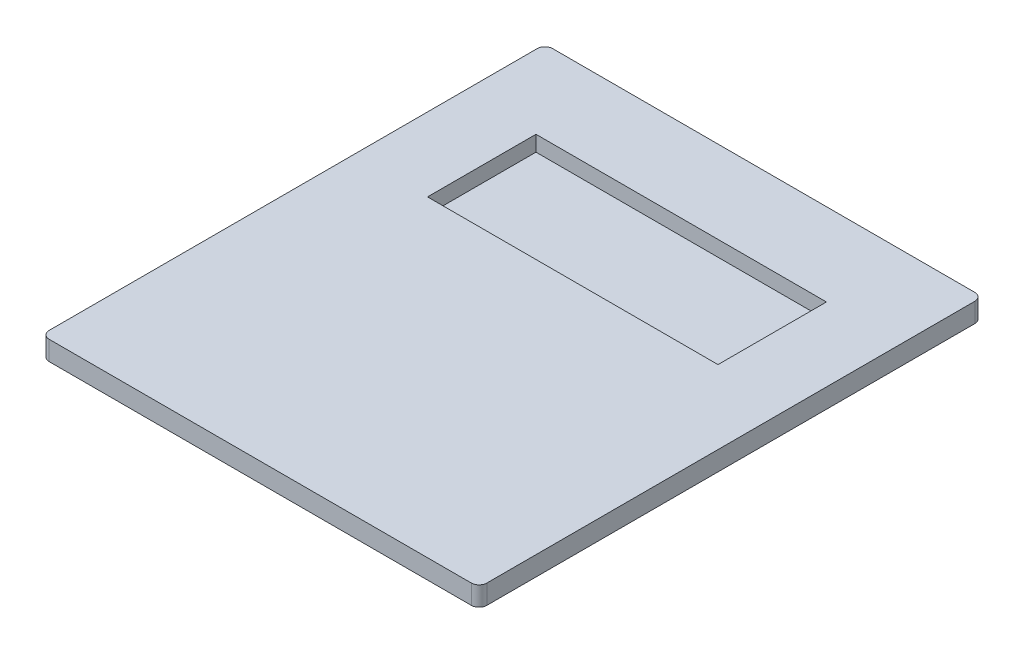
ISO-10303-21;
HEADER;
FILE_DESCRIPTION(('STEP AP214'),'2;1');
FILE_NAME('part.step','',(''),(''),'','','');
FILE_SCHEMA(('AUTOMOTIVE_DESIGN { 1 0 10303 214 1 1 1 1 }'));
ENDSEC;
DATA;
#1=APPLICATION_CONTEXT('core data for automotive mechanical design processes');
#2=APPLICATION_PROTOCOL_DEFINITION('international standard','automotive_design',2000,#1);
#3=PRODUCT_CONTEXT('',#1,'mechanical');
#4=PRODUCT('Part','Part','',(#3));
#5=PRODUCT_RELATED_PRODUCT_CATEGORY('part','',(#4));
#6=PRODUCT_DEFINITION_FORMATION('','',#4);
#7=PRODUCT_DEFINITION_CONTEXT('part definition',#1,'design');
#8=PRODUCT_DEFINITION('design','',#6,#7);
#9=PRODUCT_DEFINITION_SHAPE('','',#8);
#10=(LENGTH_UNIT() NAMED_UNIT(*) SI_UNIT(.MILLI.,.METRE.));
#11=(NAMED_UNIT(*) PLANE_ANGLE_UNIT() SI_UNIT($,.RADIAN.));
#12=(NAMED_UNIT(*) SI_UNIT($,.STERADIAN.) SOLID_ANGLE_UNIT());
#13=UNCERTAINTY_MEASURE_WITH_UNIT(LENGTH_MEASURE(1.E-05),#10,'distance_accuracy_value','');
#14=(GEOMETRIC_REPRESENTATION_CONTEXT(3) GLOBAL_UNCERTAINTY_ASSIGNED_CONTEXT((#13)) GLOBAL_UNIT_ASSIGNED_CONTEXT((#10,
#11,#12)) REPRESENTATION_CONTEXT('',''));
#15=CARTESIAN_POINT('',(0.,0.,0.));
#16=DIRECTION('',(0.,0.,1.));
#17=DIRECTION('',(1.,0.,0.));
#18=AXIS2_PLACEMENT_3D('',#15,#16,#17);
#19=CARTESIAN_POINT('',(56.5,5.,65.));
#20=DIRECTION('',(-1.,0.,0.));
#21=DIRECTION('',(0.,0.,1.));
#22=AXIS2_PLACEMENT_3D('',#19,#20,#21);
#23=PLANE('',#22);
#24=DIRECTION('',(0.,0.,-1.));
#25=VECTOR('',#24,1.);
#26=CARTESIAN_POINT('',(56.5,0.,65.));
#27=LINE('',#26,#25);
#28=CARTESIAN_POINT('',(56.5,0.,63.));
#29=VERTEX_POINT('',#28);
#30=CARTESIAN_POINT('',(56.5,0.,-63.));
#31=VERTEX_POINT('',#30);
#32=EDGE_CURVE('E158',#29,#31,#27,.T.);
#33=ORIENTED_EDGE('',*,*,#32,.T.);
#34=DIRECTION('',(0.,-1.,0.));
#35=VECTOR('',#34,1.);
#36=CARTESIAN_POINT('',(56.5,5.,-63.));
#37=LINE('',#36,#35);
#38=CARTESIAN_POINT('',(56.5,5.,-63.));
#39=VERTEX_POINT('',#38);
#40=EDGE_CURVE('E11',#31,#39,#37,.F.);
#41=ORIENTED_EDGE('',*,*,#40,.T.);
#42=DIRECTION('',(0.,0.,-1.));
#43=VECTOR('',#42,1.);
#44=CARTESIAN_POINT('',(56.5,5.,65.));
#45=LINE('',#44,#43);
#46=CARTESIAN_POINT('',(56.5,5.,63.));
#47=VERTEX_POINT('',#46);
#48=EDGE_CURVE('E162',#47,#39,#45,.T.);
#49=ORIENTED_EDGE('',*,*,#48,.F.);
#50=DIRECTION('',(0.,-1.,0.));
#51=VECTOR('',#50,1.);
#52=CARTESIAN_POINT('',(56.5,0.,63.));
#53=LINE('',#52,#51);
#54=EDGE_CURVE('E42',#47,#29,#53,.T.);
#55=ORIENTED_EDGE('',*,*,#54,.T.);
#56=EDGE_LOOP('',(#33,#41,#49,#55));
#57=FACE_BOUND('',#56,.T.);
#58=ADVANCED_FACE('F34',(#57),#23,.F.);
#59=CARTESIAN_POINT('',(56.5,5.,-65.));
#60=DIRECTION('',(0.,0.,1.));
#61=DIRECTION('',(1.,0.,0.));
#62=AXIS2_PLACEMENT_3D('',#59,#60,#61);
#63=PLANE('',#62);
#64=DIRECTION('',(-1.,0.,0.));
#65=VECTOR('',#64,1.);
#66=CARTESIAN_POINT('',(56.5,0.,-65.));
#67=LINE('',#66,#65);
#68=CARTESIAN_POINT('',(54.5,0.,-65.));
#69=VERTEX_POINT('',#68);
#70=CARTESIAN_POINT('',(-54.5,0.,-65.));
#71=VERTEX_POINT('',#70);
#72=EDGE_CURVE('E177',#69,#71,#67,.T.);
#73=ORIENTED_EDGE('',*,*,#72,.T.);
#74=DIRECTION('',(0.,-1.,0.));
#75=VECTOR('',#74,1.);
#76=CARTESIAN_POINT('',(-54.5,5.,-65.));
#77=LINE('',#76,#75);
#78=CARTESIAN_POINT('',(-54.5,5.,-65.));
#79=VERTEX_POINT('',#78);
#80=EDGE_CURVE('E200',#71,#79,#77,.F.);
#81=ORIENTED_EDGE('',*,*,#80,.T.);
#82=DIRECTION('',(-1.,0.,0.));
#83=VECTOR('',#82,1.);
#84=CARTESIAN_POINT('',(56.5,5.,-65.));
#85=LINE('',#84,#83);
#86=CARTESIAN_POINT('',(54.5,5.,-65.));
#87=VERTEX_POINT('',#86);
#88=EDGE_CURVE('E165',#87,#79,#85,.T.);
#89=ORIENTED_EDGE('',*,*,#88,.F.);
#90=DIRECTION('',(0.,-1.,0.));
#91=VECTOR('',#90,1.);
#92=CARTESIAN_POINT('',(54.5,5.,-65.));
#93=LINE('',#92,#91);
#94=EDGE_CURVE('E197',#87,#69,#93,.T.);
#95=ORIENTED_EDGE('',*,*,#94,.T.);
#96=EDGE_LOOP('',(#73,#81,#89,#95));
#97=FACE_BOUND('',#96,.T.);
#98=ADVANCED_FACE('F231',(#97),#63,.F.);
#99=CARTESIAN_POINT('',(-56.5,5.,65.));
#100=DIRECTION('',(-1.,0.,0.));
#101=DIRECTION('',(0.,0.,1.));
#102=AXIS2_PLACEMENT_3D('',#99,#100,#101);
#103=PLANE('',#102);
#104=DIRECTION('',(0.,0.,-1.));
#105=VECTOR('',#104,1.);
#106=CARTESIAN_POINT('',(-56.5,5.,65.));
#107=LINE('',#106,#105);
#108=CARTESIAN_POINT('',(-56.5,5.,63.));
#109=VERTEX_POINT('',#108);
#110=CARTESIAN_POINT('',(-56.5,5.,-63.));
#111=VERTEX_POINT('',#110);
#112=EDGE_CURVE('E169',#109,#111,#107,.T.);
#113=ORIENTED_EDGE('',*,*,#112,.T.);
#114=DIRECTION('',(0.,-1.,0.));
#115=VECTOR('',#114,1.);
#116=CARTESIAN_POINT('',(-56.5,0.,-63.));
#117=LINE('',#116,#115);
#118=CARTESIAN_POINT('',(-56.5,0.,-63.));
#119=VERTEX_POINT('',#118);
#120=EDGE_CURVE('E186',#111,#119,#117,.T.);
#121=ORIENTED_EDGE('',*,*,#120,.T.);
#122=DIRECTION('',(0.,0.,-1.));
#123=VECTOR('',#122,1.);
#124=CARTESIAN_POINT('',(-56.5,0.,65.));
#125=LINE('',#124,#123);
#126=CARTESIAN_POINT('',(-56.5,0.,63.));
#127=VERTEX_POINT('',#126);
#128=EDGE_CURVE('E180',#127,#119,#125,.T.);
#129=ORIENTED_EDGE('',*,*,#128,.F.);
#130=DIRECTION('',(0.,-1.,0.));
#131=VECTOR('',#130,1.);
#132=CARTESIAN_POINT('',(-56.5,5.,63.));
#133=LINE('',#132,#131);
#134=EDGE_CURVE('E174',#127,#109,#133,.F.);
#135=ORIENTED_EDGE('',*,*,#134,.T.);
#136=EDGE_LOOP('',(#113,#121,#129,#135));
#137=FACE_BOUND('',#136,.T.);
#138=ADVANCED_FACE('F240',(#137),#103,.T.);
#139=CARTESIAN_POINT('',(56.5,5.,65.));
#140=DIRECTION('',(0.,0.,1.));
#141=DIRECTION('',(1.,0.,0.));
#142=AXIS2_PLACEMENT_3D('',#139,#140,#141);
#143=PLANE('',#142);
#144=DIRECTION('',(-1.,0.,0.));
#145=VECTOR('',#144,1.);
#146=CARTESIAN_POINT('',(56.5,5.,65.));
#147=LINE('',#146,#145);
#148=CARTESIAN_POINT('',(54.5,5.,65.));
#149=VERTEX_POINT('',#148);
#150=CARTESIAN_POINT('',(-54.5,5.,65.));
#151=VERTEX_POINT('',#150);
#152=EDGE_CURVE('E172',#149,#151,#147,.T.);
#153=ORIENTED_EDGE('',*,*,#152,.T.);
#154=DIRECTION('',(0.,-1.,0.));
#155=VECTOR('',#154,1.);
#156=CARTESIAN_POINT('',(-54.5,5.,65.));
#157=LINE('',#156,#155);
#158=CARTESIAN_POINT('',(-54.5,0.,65.));
#159=VERTEX_POINT('',#158);
#160=EDGE_CURVE('E211',#151,#159,#157,.T.);
#161=ORIENTED_EDGE('',*,*,#160,.T.);
#162=DIRECTION('',(-1.,0.,0.));
#163=VECTOR('',#162,1.);
#164=CARTESIAN_POINT('',(56.5,0.,65.));
#165=LINE('',#164,#163);
#166=CARTESIAN_POINT('',(54.5,0.,65.));
#167=VERTEX_POINT('',#166);
#168=EDGE_CURVE('E166',#167,#159,#165,.T.);
#169=ORIENTED_EDGE('',*,*,#168,.F.);
#170=DIRECTION('',(0.,-1.,0.));
#171=VECTOR('',#170,1.);
#172=CARTESIAN_POINT('',(54.5,5.,65.));
#173=LINE('',#172,#171);
#174=EDGE_CURVE('E209',#167,#149,#173,.F.);
#175=ORIENTED_EDGE('',*,*,#174,.T.);
#176=EDGE_LOOP('',(#153,#161,#169,#175));
#177=FACE_BOUND('',#176,.T.);
#178=ADVANCED_FACE('F246',(#177),#143,.T.);
#179=CARTESIAN_POINT('',(0.,5.,0.));
#180=DIRECTION('',(0.,1.,0.));
#181=DIRECTION('',(0.,0.,1.));
#182=AXIS2_PLACEMENT_3D('',#179,#180,#181);
#183=PLANE('',#182);
#184=DIRECTION('',(0.,0.,1.));
#185=VECTOR('',#184,1.);
#186=CARTESIAN_POINT('',(-37.5,5.,-43.6893203883494));
#187=LINE('',#186,#185);
#188=CARTESIAN_POINT('',(-37.5,5.,-43.6893203883494));
#189=VERTEX_POINT('',#188);
#190=CARTESIAN_POINT('',(-37.5,5.,-15.6893203883494));
#191=VERTEX_POINT('',#190);
#192=EDGE_CURVE('E49',#189,#191,#187,.T.);
#193=ORIENTED_EDGE('',*,*,#192,.F.);
#194=DIRECTION('',(1.,0.,0.));
#195=VECTOR('',#194,1.);
#196=CARTESIAN_POINT('',(-37.5,5.,-43.6893203883494));
#197=LINE('',#196,#195);
#198=CARTESIAN_POINT('',(37.5,5.,-43.6893203883494));
#199=VERTEX_POINT('',#198);
#200=EDGE_CURVE('E143',#189,#199,#197,.T.);
#201=ORIENTED_EDGE('',*,*,#200,.T.);
#202=DIRECTION('',(0.,0.,1.));
#203=VECTOR('',#202,1.);
#204=CARTESIAN_POINT('',(37.5,5.,-43.6893203883494));
#205=LINE('',#204,#203);
#206=CARTESIAN_POINT('',(37.5,5.,-15.6893203883494));
#207=VERTEX_POINT('',#206);
#208=EDGE_CURVE('E146',#199,#207,#205,.T.);
#209=ORIENTED_EDGE('',*,*,#208,.T.);
#210=DIRECTION('',(1.,0.,0.));
#211=VECTOR('',#210,1.);
#212=CARTESIAN_POINT('',(-37.5,5.,-15.6893203883494));
#213=LINE('',#212,#211);
#214=EDGE_CURVE('E152',#191,#207,#213,.T.);
#215=ORIENTED_EDGE('',*,*,#214,.F.);
#216=EDGE_LOOP('',(#193,#201,#209,#215));
#217=FACE_BOUND('',#216,.T.);
#218=ORIENTED_EDGE('',*,*,#88,.T.);
#219=CARTESIAN_POINT('',(-54.5,5.,-63.));
#220=DIRECTION('',(0.,1.,0.));
#221=DIRECTION('',(0.,0.,1.));
#222=AXIS2_PLACEMENT_3D('',#219,#220,#221);
#223=CIRCLE('',#222,2.);
#224=EDGE_CURVE('E207',#79,#111,#223,.T.);
#225=ORIENTED_EDGE('',*,*,#224,.T.);
#226=ORIENTED_EDGE('',*,*,#112,.F.);
#227=CARTESIAN_POINT('',(-54.5,5.,63.));
#228=DIRECTION('',(0.,1.,0.));
#229=DIRECTION('',(0.,0.,1.));
#230=AXIS2_PLACEMENT_3D('',#227,#228,#229);
#231=CIRCLE('',#230,2.);
#232=EDGE_CURVE('E57',#109,#151,#231,.T.);
#233=ORIENTED_EDGE('',*,*,#232,.T.);
#234=ORIENTED_EDGE('',*,*,#152,.F.);
#235=CARTESIAN_POINT('',(54.5,5.,63.));
#236=DIRECTION('',(0.,1.,0.));
#237=DIRECTION('',(0.,0.,1.));
#238=AXIS2_PLACEMENT_3D('',#235,#236,#237);
#239=CIRCLE('',#238,2.);
#240=EDGE_CURVE('E202',#149,#47,#239,.T.);
#241=ORIENTED_EDGE('',*,*,#240,.T.);
#242=ORIENTED_EDGE('',*,*,#48,.T.);
#243=CARTESIAN_POINT('',(54.5,5.,-63.));
#244=DIRECTION('',(0.,1.,0.));
#245=DIRECTION('',(0.,0.,1.));
#246=AXIS2_PLACEMENT_3D('',#243,#244,#245);
#247=CIRCLE('',#246,2.);
#248=EDGE_CURVE('E204',#39,#87,#247,.T.);
#249=ORIENTED_EDGE('',*,*,#248,.T.);
#250=EDGE_LOOP('',(#218,#225,#226,#233,#234,#241,#242,#249));
#251=FACE_BOUND('',#250,.T.);
#252=ADVANCED_FACE('F234',(#217,#251),#183,.T.);
#253=CARTESIAN_POINT('',(0.,0.,0.));
#254=DIRECTION('',(0.,1.,0.));
#255=DIRECTION('',(0.,0.,1.));
#256=AXIS2_PLACEMENT_3D('',#253,#254,#255);
#257=PLANE('',#256);
#258=ORIENTED_EDGE('',*,*,#128,.T.);
#259=CARTESIAN_POINT('',(-54.5,0.,-63.));
#260=DIRECTION('',(0.,1.,0.));
#261=DIRECTION('',(0.,0.,1.));
#262=AXIS2_PLACEMENT_3D('',#259,#260,#261);
#263=CIRCLE('',#262,2.);
#264=EDGE_CURVE('E195',#119,#71,#263,.F.);
#265=ORIENTED_EDGE('',*,*,#264,.T.);
#266=ORIENTED_EDGE('',*,*,#72,.F.);
#267=CARTESIAN_POINT('',(54.5,0.,-63.));
#268=DIRECTION('',(0.,1.,0.));
#269=DIRECTION('',(0.,0.,1.));
#270=AXIS2_PLACEMENT_3D('',#267,#268,#269);
#271=CIRCLE('',#270,2.);
#272=EDGE_CURVE('E191',#69,#31,#271,.F.);
#273=ORIENTED_EDGE('',*,*,#272,.T.);
#274=ORIENTED_EDGE('',*,*,#32,.F.);
#275=CARTESIAN_POINT('',(54.5,0.,63.));
#276=DIRECTION('',(0.,1.,0.));
#277=DIRECTION('',(0.,0.,1.));
#278=AXIS2_PLACEMENT_3D('',#275,#276,#277);
#279=CIRCLE('',#278,2.);
#280=EDGE_CURVE('E189',#29,#167,#279,.F.);
#281=ORIENTED_EDGE('',*,*,#280,.T.);
#282=ORIENTED_EDGE('',*,*,#168,.T.);
#283=CARTESIAN_POINT('',(-54.5,0.,63.));
#284=DIRECTION('',(0.,1.,0.));
#285=DIRECTION('',(0.,0.,1.));
#286=AXIS2_PLACEMENT_3D('',#283,#284,#285);
#287=CIRCLE('',#286,2.);
#288=EDGE_CURVE('E193',#159,#127,#287,.F.);
#289=ORIENTED_EDGE('',*,*,#288,.T.);
#290=EDGE_LOOP('',(#258,#265,#266,#273,#274,#281,#282,#289));
#291=FACE_BOUND('',#290,.T.);
#292=ADVANCED_FACE('F222',(#291),#257,.F.);
#293=CARTESIAN_POINT('',(-54.5,5.,-63.));
#294=DIRECTION('',(0.,1.,0.));
#295=DIRECTION('',(0.,0.,1.));
#296=AXIS2_PLACEMENT_3D('',#293,#294,#295);
#297=CYLINDRICAL_SURFACE('',#296,2.);
#298=ORIENTED_EDGE('',*,*,#224,.F.);
#299=ORIENTED_EDGE('',*,*,#80,.F.);
#300=ORIENTED_EDGE('',*,*,#264,.F.);
#301=ORIENTED_EDGE('',*,*,#120,.F.);
#302=EDGE_LOOP('',(#298,#299,#300,#301));
#303=FACE_BOUND('',#302,.T.);
#304=ADVANCED_FACE('F237',(#303),#297,.T.);
#305=CARTESIAN_POINT('',(-54.5,5.,63.));
#306=DIRECTION('',(0.,-1.,0.));
#307=DIRECTION('',(0.,0.,-1.));
#308=AXIS2_PLACEMENT_3D('',#305,#306,#307);
#309=CYLINDRICAL_SURFACE('',#308,2.);
#310=ORIENTED_EDGE('',*,*,#232,.F.);
#311=ORIENTED_EDGE('',*,*,#134,.F.);
#312=ORIENTED_EDGE('',*,*,#288,.F.);
#313=ORIENTED_EDGE('',*,*,#160,.F.);
#314=EDGE_LOOP('',(#310,#311,#312,#313));
#315=FACE_BOUND('',#314,.T.);
#316=ADVANCED_FACE('F244',(#315),#309,.T.);
#317=CARTESIAN_POINT('',(54.5,5.,-63.));
#318=DIRECTION('',(0.,-1.,0.));
#319=DIRECTION('',(0.,0.,-1.));
#320=AXIS2_PLACEMENT_3D('',#317,#318,#319);
#321=CYLINDRICAL_SURFACE('',#320,2.);
#322=ORIENTED_EDGE('',*,*,#248,.F.);
#323=ORIENTED_EDGE('',*,*,#40,.F.);
#324=ORIENTED_EDGE('',*,*,#272,.F.);
#325=ORIENTED_EDGE('',*,*,#94,.F.);
#326=EDGE_LOOP('',(#322,#323,#324,#325));
#327=FACE_BOUND('',#326,.T.);
#328=ADVANCED_FACE('F228',(#327),#321,.T.);
#329=CARTESIAN_POINT('',(54.5,5.,63.));
#330=DIRECTION('',(0.,1.,0.));
#331=DIRECTION('',(0.,0.,1.));
#332=AXIS2_PLACEMENT_3D('',#329,#330,#331);
#333=CYLINDRICAL_SURFACE('',#332,2.);
#334=ORIENTED_EDGE('',*,*,#240,.F.);
#335=ORIENTED_EDGE('',*,*,#174,.F.);
#336=ORIENTED_EDGE('',*,*,#280,.F.);
#337=ORIENTED_EDGE('',*,*,#54,.F.);
#338=EDGE_LOOP('',(#334,#335,#336,#337));
#339=FACE_BOUND('',#338,.T.);
#340=ADVANCED_FACE('F36',(#339),#333,.T.);
#341=CARTESIAN_POINT('',(-37.5,1.,-43.6893203883494));
#342=DIRECTION('',(-1.,0.,0.));
#343=DIRECTION('',(0.,0.,1.));
#344=AXIS2_PLACEMENT_3D('',#341,#342,#343);
#345=PLANE('',#344);
#346=ORIENTED_EDGE('',*,*,#192,.T.);
#347=DIRECTION('',(0.,1.,0.));
#348=VECTOR('',#347,1.);
#349=CARTESIAN_POINT('',(-37.5,1.,-15.6893203883494));
#350=LINE('',#349,#348);
#351=CARTESIAN_POINT('',(-37.5,1.,-15.6893203883494));
#352=VERTEX_POINT('',#351);
#353=EDGE_CURVE('E122',#352,#191,#350,.T.);
#354=ORIENTED_EDGE('',*,*,#353,.F.);
#355=DIRECTION('',(0.,0.,1.));
#356=VECTOR('',#355,1.);
#357=CARTESIAN_POINT('',(-37.5,1.,-43.6893203883494));
#358=LINE('',#357,#356);
#359=CARTESIAN_POINT('',(-37.5,1.,-43.6893203883494));
#360=VERTEX_POINT('',#359);
#361=EDGE_CURVE('E126',#360,#352,#358,.T.);
#362=ORIENTED_EDGE('',*,*,#361,.F.);
#363=DIRECTION('',(0.,1.,0.));
#364=VECTOR('',#363,1.);
#365=CARTESIAN_POINT('',(-37.5,1.,-43.6893203883494));
#366=LINE('',#365,#364);
#367=EDGE_CURVE('E156',#360,#189,#366,.T.);
#368=ORIENTED_EDGE('',*,*,#367,.T.);
#369=EDGE_LOOP('',(#346,#354,#362,#368));
#370=FACE_BOUND('',#369,.T.);
#371=ADVANCED_FACE('F124',(#370),#345,.F.);
#372=CARTESIAN_POINT('',(-37.5,1.,-43.6893203883494));
#373=DIRECTION('',(0.,0.,1.));
#374=DIRECTION('',(1.,0.,0.));
#375=AXIS2_PLACEMENT_3D('',#372,#373,#374);
#376=PLANE('',#375);
#377=ORIENTED_EDGE('',*,*,#200,.F.);
#378=ORIENTED_EDGE('',*,*,#367,.F.);
#379=DIRECTION('',(1.,0.,0.));
#380=VECTOR('',#379,1.);
#381=CARTESIAN_POINT('',(-37.5,1.,-43.6893203883494));
#382=LINE('',#381,#380);
#383=CARTESIAN_POINT('',(37.5,1.,-43.6893203883494));
#384=VERTEX_POINT('',#383);
#385=EDGE_CURVE('E131',#360,#384,#382,.T.);
#386=ORIENTED_EDGE('',*,*,#385,.T.);
#387=DIRECTION('',(0.,1.,0.));
#388=VECTOR('',#387,1.);
#389=CARTESIAN_POINT('',(37.5,1.,-43.6893203883494));
#390=LINE('',#389,#388);
#391=EDGE_CURVE('E159',#384,#199,#390,.T.);
#392=ORIENTED_EDGE('',*,*,#391,.T.);
#393=EDGE_LOOP('',(#377,#378,#386,#392));
#394=FACE_BOUND('',#393,.T.);
#395=ADVANCED_FACE('F253',(#394),#376,.T.);
#396=CARTESIAN_POINT('',(37.5,1.,-43.6893203883494));
#397=DIRECTION('',(-1.,0.,0.));
#398=DIRECTION('',(0.,0.,1.));
#399=AXIS2_PLACEMENT_3D('',#396,#397,#398);
#400=PLANE('',#399);
#401=ORIENTED_EDGE('',*,*,#208,.F.);
#402=ORIENTED_EDGE('',*,*,#391,.F.);
#403=DIRECTION('',(0.,0.,1.));
#404=VECTOR('',#403,1.);
#405=CARTESIAN_POINT('',(37.5,1.,-43.6893203883494));
#406=LINE('',#405,#404);
#407=CARTESIAN_POINT('',(37.5,1.,-15.6893203883494));
#408=VERTEX_POINT('',#407);
#409=EDGE_CURVE('E139',#384,#408,#406,.T.);
#410=ORIENTED_EDGE('',*,*,#409,.T.);
#411=DIRECTION('',(0.,1.,0.));
#412=VECTOR('',#411,1.);
#413=CARTESIAN_POINT('',(37.5,1.,-15.6893203883494));
#414=LINE('',#413,#412);
#415=EDGE_CURVE('E130',#408,#207,#414,.T.);
#416=ORIENTED_EDGE('',*,*,#415,.T.);
#417=EDGE_LOOP('',(#401,#402,#410,#416));
#418=FACE_BOUND('',#417,.T.);
#419=ADVANCED_FACE('F306',(#418),#400,.T.);
#420=CARTESIAN_POINT('',(-37.5,1.,-15.6893203883494));
#421=DIRECTION('',(0.,0.,1.));
#422=DIRECTION('',(1.,0.,0.));
#423=AXIS2_PLACEMENT_3D('',#420,#421,#422);
#424=PLANE('',#423);
#425=ORIENTED_EDGE('',*,*,#214,.T.);
#426=ORIENTED_EDGE('',*,*,#415,.F.);
#427=DIRECTION('',(1.,0.,0.));
#428=VECTOR('',#427,1.);
#429=CARTESIAN_POINT('',(-37.5,1.,-15.6893203883494));
#430=LINE('',#429,#428);
#431=EDGE_CURVE('E135',#352,#408,#430,.T.);
#432=ORIENTED_EDGE('',*,*,#431,.F.);
#433=ORIENTED_EDGE('',*,*,#353,.T.);
#434=EDGE_LOOP('',(#425,#426,#432,#433));
#435=FACE_BOUND('',#434,.T.);
#436=ADVANCED_FACE('F136',(#435),#424,.F.);
#437=CARTESIAN_POINT('',(0.,1.,0.));
#438=DIRECTION('',(0.,1.,0.));
#439=DIRECTION('',(0.,0.,1.));
#440=AXIS2_PLACEMENT_3D('',#437,#438,#439);
#441=PLANE('',#440);
#442=ORIENTED_EDGE('',*,*,#361,.T.);
#443=ORIENTED_EDGE('',*,*,#431,.T.);
#444=ORIENTED_EDGE('',*,*,#409,.F.);
#445=ORIENTED_EDGE('',*,*,#385,.F.);
#446=EDGE_LOOP('',(#442,#443,#444,#445));
#447=FACE_BOUND('',#446,.T.);
#448=ADVANCED_FACE('F142',(#447),#441,.T.);
#449=CLOSED_SHELL('',(#58,#98,#138,#178,#252,#292,#304,#316,#328,#340,#371,#395,#419,#436,#448));
#450=MANIFOLD_SOLID_BREP('B2',#449);
#451=ADVANCED_BREP_SHAPE_REPRESENTATION('',(#18,#450),#14);
#452=SHAPE_DEFINITION_REPRESENTATION(#9,#451);
ENDSEC;
END-ISO-10303-21;
